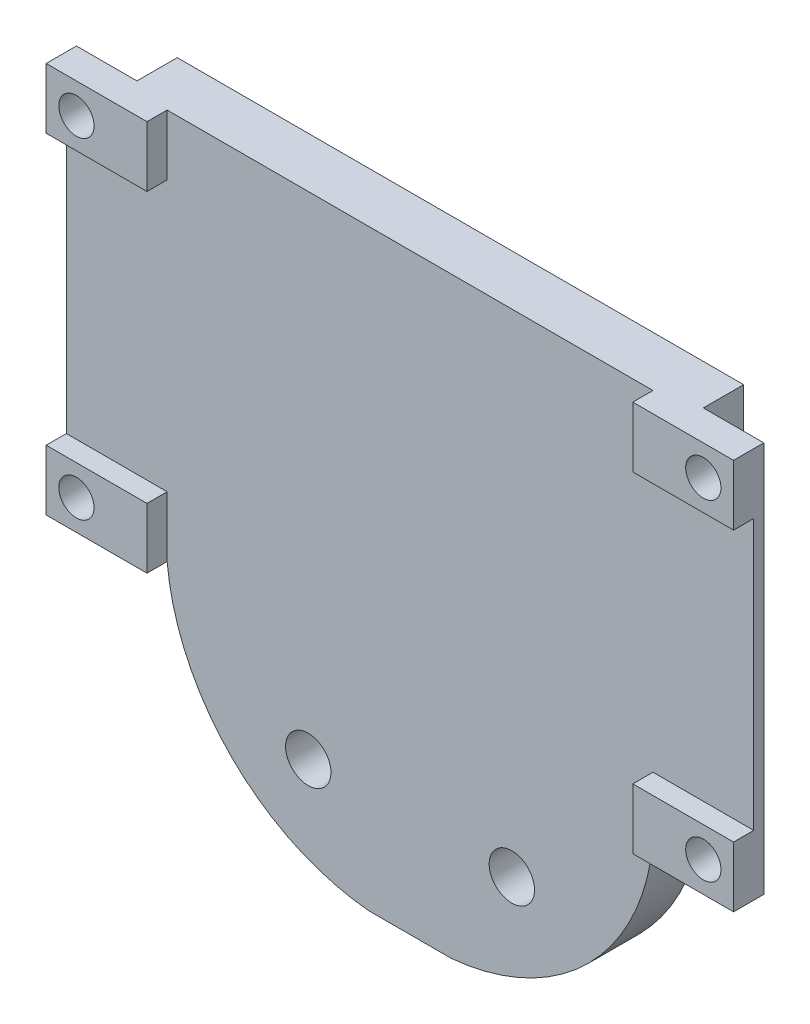
ISO-10303-21;
HEADER;
FILE_DESCRIPTION(('STEP AP214'),'2;1');
FILE_NAME('part.step','',(''),(''),'','','');
FILE_SCHEMA(('AUTOMOTIVE_DESIGN { 1 0 10303 214 1 1 1 1 }'));
ENDSEC;
DATA;
#1=APPLICATION_CONTEXT('core data for automotive mechanical design processes');
#2=APPLICATION_PROTOCOL_DEFINITION('international standard','automotive_design',2000,#1);
#3=PRODUCT_CONTEXT('',#1,'mechanical');
#4=PRODUCT('Part','Part','',(#3));
#5=PRODUCT_RELATED_PRODUCT_CATEGORY('part','',(#4));
#6=PRODUCT_DEFINITION_FORMATION('','',#4);
#7=PRODUCT_DEFINITION_CONTEXT('part definition',#1,'design');
#8=PRODUCT_DEFINITION('design','',#6,#7);
#9=PRODUCT_DEFINITION_SHAPE('','',#8);
#10=(LENGTH_UNIT() NAMED_UNIT(*) SI_UNIT(.MILLI.,.METRE.));
#11=(NAMED_UNIT(*) PLANE_ANGLE_UNIT() SI_UNIT($,.RADIAN.));
#12=(NAMED_UNIT(*) SI_UNIT($,.STERADIAN.) SOLID_ANGLE_UNIT());
#13=UNCERTAINTY_MEASURE_WITH_UNIT(LENGTH_MEASURE(1.E-05),#10,'distance_accuracy_value','');
#14=(GEOMETRIC_REPRESENTATION_CONTEXT(3) GLOBAL_UNCERTAINTY_ASSIGNED_CONTEXT((#13)) GLOBAL_UNIT_ASSIGNED_CONTEXT((#10,
#11,#12)) REPRESENTATION_CONTEXT('',''));
#15=CARTESIAN_POINT('',(0.,0.,0.));
#16=DIRECTION('',(0.,0.,1.));
#17=DIRECTION('',(1.,0.,0.));
#18=AXIS2_PLACEMENT_3D('',#15,#16,#17);
#19=CARTESIAN_POINT('',(0.,0.,1.));
#20=DIRECTION('',(0.,0.,-1.));
#21=DIRECTION('',(-1.,0.,0.));
#22=AXIS2_PLACEMENT_3D('',#19,#20,#21);
#23=PLANE('',#22);
#24=CARTESIAN_POINT('',(24.,-10.,1.));
#25=DIRECTION('',(0.,0.,1.));
#26=DIRECTION('',(1.,0.,0.));
#27=AXIS2_PLACEMENT_3D('',#24,#25,#26);
#28=CIRCLE('',#27,2.25);
#29=CARTESIAN_POINT('',(26.25,-10.,1.));
#30=VERTEX_POINT('',#29);
#31=EDGE_CURVE('E557',#30,#30,#28,.T.);
#32=ORIENTED_EDGE('',*,*,#31,.F.);
#33=EDGE_LOOP('',(#32));
#34=FACE_BOUND('',#33,.T.);
#35=CARTESIAN_POINT('',(44.2,-10.,1.));
#36=DIRECTION('',(0.,0.,1.));
#37=DIRECTION('',(1.,0.,0.));
#38=AXIS2_PLACEMENT_3D('',#35,#36,#37);
#39=CIRCLE('',#38,2.25);
#40=CARTESIAN_POINT('',(46.45,-10.,1.));
#41=VERTEX_POINT('',#40);
#42=EDGE_CURVE('E243',#41,#41,#39,.T.);
#43=ORIENTED_EDGE('',*,*,#42,.F.);
#44=EDGE_LOOP('',(#43));
#45=FACE_BOUND('',#44,.T.);
#46=DIRECTION('',(1.,0.,0.));
#47=VECTOR('',#46,1.);
#48=CARTESIAN_POINT('',(10.,-20.,1.));
#49=LINE('',#48,#47);
#50=CARTESIAN_POINT('',(30.0000000000001,-20.,1.));
#51=VERTEX_POINT('',#50);
#52=CARTESIAN_POINT('',(38.2,-20.,1.));
#53=VERTEX_POINT('',#52);
#54=EDGE_CURVE('E241',#51,#53,#49,.T.);
#55=ORIENTED_EDGE('',*,*,#54,.T.);
#56=CARTESIAN_POINT('',(36.15,2.05000000000001,1.));
#57=DIRECTION('',(0.,0.,1.));
#58=DIRECTION('',(1.,0.,0.));
#59=AXIS2_PLACEMENT_3D('',#56,#57,#58);
#60=CIRCLE('',#59,22.1450897491972);
#61=CARTESIAN_POINT('',(58.2,0.,1.));
#62=VERTEX_POINT('',#61);
#63=EDGE_CURVE('E86',#62,#53,#60,.F.);
#64=ORIENTED_EDGE('',*,*,#63,.F.);
#65=DIRECTION('',(0.,1.,0.));
#66=VECTOR('',#65,1.);
#67=CARTESIAN_POINT('',(58.2,0.,1.));
#68=LINE('',#67,#66);
#69=CARTESIAN_POINT('',(58.2,6.,1.));
#70=VERTEX_POINT('',#69);
#71=EDGE_CURVE('E238',#62,#70,#68,.T.);
#72=ORIENTED_EDGE('',*,*,#71,.T.);
#73=DIRECTION('',(-1.,0.,0.));
#74=VECTOR('',#73,1.);
#75=CARTESIAN_POINT('',(68.2,6.,1.));
#76=LINE('',#75,#74);
#77=CARTESIAN_POINT('',(68.2,6.,1.));
#78=VERTEX_POINT('',#77);
#79=EDGE_CURVE('E341',#78,#70,#76,.T.);
#80=ORIENTED_EDGE('',*,*,#79,.F.);
#81=DIRECTION('',(0.,1.,0.));
#82=VECTOR('',#81,1.);
#83=CARTESIAN_POINT('',(68.2,0.,1.));
#84=LINE('',#83,#82);
#85=CARTESIAN_POINT('',(68.2,32.8,1.));
#86=VERTEX_POINT('',#85);
#87=EDGE_CURVE('E373',#78,#86,#84,.T.);
#88=ORIENTED_EDGE('',*,*,#87,.T.);
#89=DIRECTION('',(1.,0.,0.));
#90=VECTOR('',#89,1.);
#91=CARTESIAN_POINT('',(62.2,32.8,1.));
#92=LINE('',#91,#90);
#93=CARTESIAN_POINT('',(58.2,32.8,1.));
#94=VERTEX_POINT('',#93);
#95=EDGE_CURVE('E344',#94,#86,#92,.T.);
#96=ORIENTED_EDGE('',*,*,#95,.F.);
#97=DIRECTION('',(0.,-1.,0.));
#98=VECTOR('',#97,1.);
#99=CARTESIAN_POINT('',(58.2,0.,1.));
#100=LINE('',#99,#98);
#101=CARTESIAN_POINT('',(58.2,38.8,1.));
#102=VERTEX_POINT('',#101);
#103=EDGE_CURVE('E266',#102,#94,#100,.T.);
#104=ORIENTED_EDGE('',*,*,#103,.F.);
#105=DIRECTION('',(-1.,0.,0.));
#106=VECTOR('',#105,1.);
#107=CARTESIAN_POINT('',(0.,38.8,1.));
#108=LINE('',#107,#106);
#109=CARTESIAN_POINT('',(10.,38.8,1.));
#110=VERTEX_POINT('',#109);
#111=EDGE_CURVE('E377',#102,#110,#108,.T.);
#112=ORIENTED_EDGE('',*,*,#111,.T.);
#113=DIRECTION('',(0.,-1.,0.));
#114=VECTOR('',#113,1.);
#115=CARTESIAN_POINT('',(9.99999999999999,0.,1.));
#116=LINE('',#115,#114);
#117=CARTESIAN_POINT('',(10.,32.8,1.));
#118=VERTEX_POINT('',#117);
#119=EDGE_CURVE('E481',#110,#118,#116,.T.);
#120=ORIENTED_EDGE('',*,*,#119,.T.);
#121=DIRECTION('',(1.,0.,0.));
#122=VECTOR('',#121,1.);
#123=CARTESIAN_POINT('',(6.,32.8,1.));
#124=LINE('',#123,#122);
#125=CARTESIAN_POINT('',(0.,32.8,1.));
#126=VERTEX_POINT('',#125);
#127=EDGE_CURVE('E300',#126,#118,#124,.T.);
#128=ORIENTED_EDGE('',*,*,#127,.F.);
#129=DIRECTION('',(0.,-1.,0.));
#130=VECTOR('',#129,1.);
#131=CARTESIAN_POINT('',(0.,0.,1.));
#132=LINE('',#131,#130);
#133=CARTESIAN_POINT('',(0.,6.,1.));
#134=VERTEX_POINT('',#133);
#135=EDGE_CURVE('E370',#126,#134,#132,.T.);
#136=ORIENTED_EDGE('',*,*,#135,.T.);
#137=DIRECTION('',(-1.,0.,0.));
#138=VECTOR('',#137,1.);
#139=CARTESIAN_POINT('',(6.,6.,1.));
#140=LINE('',#139,#138);
#141=CARTESIAN_POINT('',(10.,6.,1.));
#142=VERTEX_POINT('',#141);
#143=EDGE_CURVE('E323',#142,#134,#140,.T.);
#144=ORIENTED_EDGE('',*,*,#143,.F.);
#145=DIRECTION('',(0.,1.,0.));
#146=VECTOR('',#145,1.);
#147=CARTESIAN_POINT('',(10.,0.,1.));
#148=LINE('',#147,#146);
#149=CARTESIAN_POINT('',(10.,0.,1.));
#150=VERTEX_POINT('',#149);
#151=EDGE_CURVE('E497',#150,#142,#148,.T.);
#152=ORIENTED_EDGE('',*,*,#151,.F.);
#153=CARTESIAN_POINT('',(32.05,2.05000000000005,1.));
#154=DIRECTION('',(0.,0.,1.));
#155=DIRECTION('',(1.,0.,0.));
#156=AXIS2_PLACEMENT_3D('',#153,#154,#155);
#157=CIRCLE('',#156,22.1450897491973);
#158=EDGE_CURVE('E422',#150,#51,#157,.T.);
#159=ORIENTED_EDGE('',*,*,#158,.T.);
#160=EDGE_LOOP('',(#55,#64,#72,#80,#88,#96,#104,#112,#120,#128,#136,#144,#152,#159));
#161=FACE_BOUND('',#160,.T.);
#162=ADVANCED_FACE('F68',(#34,#45,#161),#23,.F.);
#163=CARTESIAN_POINT('',(0.,0.,-4.));
#164=DIRECTION('',(0.,0.,-1.));
#165=DIRECTION('',(-1.,0.,0.));
#166=AXIS2_PLACEMENT_3D('',#163,#164,#165);
#167=PLANE('',#166);
#168=CARTESIAN_POINT('',(24.,-10.,-4.));
#169=DIRECTION('',(0.,0.,-1.));
#170=DIRECTION('',(-1.,0.,0.));
#171=AXIS2_PLACEMENT_3D('',#168,#169,#170);
#172=CIRCLE('',#171,2.25);
#173=CARTESIAN_POINT('',(21.75,-10.,-4.));
#174=VERTEX_POINT('',#173);
#175=EDGE_CURVE('E72',#174,#174,#172,.T.);
#176=ORIENTED_EDGE('',*,*,#175,.F.);
#177=EDGE_LOOP('',(#176));
#178=FACE_BOUND('',#177,.T.);
#179=CARTESIAN_POINT('',(44.2,-10.,-4.));
#180=DIRECTION('',(0.,0.,-1.));
#181=DIRECTION('',(-1.,0.,0.));
#182=AXIS2_PLACEMENT_3D('',#179,#180,#181);
#183=CIRCLE('',#182,2.25);
#184=CARTESIAN_POINT('',(41.95,-10.,-4.));
#185=VERTEX_POINT('',#184);
#186=EDGE_CURVE('E412',#185,#185,#183,.T.);
#187=ORIENTED_EDGE('',*,*,#186,.F.);
#188=EDGE_LOOP('',(#187));
#189=FACE_BOUND('',#188,.T.);
#190=CARTESIAN_POINT('',(36.15,2.05000000000001,-4.));
#191=DIRECTION('',(0.,0.,-1.));
#192=DIRECTION('',(-1.,0.,0.));
#193=AXIS2_PLACEMENT_3D('',#190,#191,#192);
#194=CIRCLE('',#193,22.1450897491972);
#195=CARTESIAN_POINT('',(38.2,-20.,-4.));
#196=VERTEX_POINT('',#195);
#197=CARTESIAN_POINT('',(58.2,0.,-4.));
#198=VERTEX_POINT('',#197);
#199=EDGE_CURVE('E226',#196,#198,#194,.F.);
#200=ORIENTED_EDGE('',*,*,#199,.F.);
#201=DIRECTION('',(1.,0.,0.));
#202=VECTOR('',#201,1.);
#203=CARTESIAN_POINT('',(10.,-20.,-4.));
#204=LINE('',#203,#202);
#205=CARTESIAN_POINT('',(30.0000000000001,-20.,-4.));
#206=VERTEX_POINT('',#205);
#207=EDGE_CURVE('E426',#206,#196,#204,.T.);
#208=ORIENTED_EDGE('',*,*,#207,.F.);
#209=CARTESIAN_POINT('',(32.05,2.05000000000005,-4.));
#210=DIRECTION('',(0.,0.,-1.));
#211=DIRECTION('',(-1.,0.,0.));
#212=AXIS2_PLACEMENT_3D('',#209,#210,#211);
#213=CIRCLE('',#212,22.1450897491973);
#214=CARTESIAN_POINT('',(10.,0.,-4.));
#215=VERTEX_POINT('',#214);
#216=EDGE_CURVE('E93',#206,#215,#213,.T.);
#217=ORIENTED_EDGE('',*,*,#216,.T.);
#218=DIRECTION('',(-1.,0.,0.));
#219=VECTOR('',#218,1.);
#220=CARTESIAN_POINT('',(62.2,0.,-4.));
#221=LINE('',#220,#219);
#222=CARTESIAN_POINT('',(6.,0.,-4.));
#223=VERTEX_POINT('',#222);
#224=EDGE_CURVE('E439',#215,#223,#221,.T.);
#225=ORIENTED_EDGE('',*,*,#224,.T.);
#226=DIRECTION('',(0.,1.,0.));
#227=VECTOR('',#226,1.);
#228=CARTESIAN_POINT('',(6.,38.8,-4.));
#229=LINE('',#228,#227);
#230=CARTESIAN_POINT('',(6.,38.8,-4.));
#231=VERTEX_POINT('',#230);
#232=EDGE_CURVE('E444',#223,#231,#229,.T.);
#233=ORIENTED_EDGE('',*,*,#232,.T.);
#234=DIRECTION('',(1.,0.,0.));
#235=VECTOR('',#234,1.);
#236=CARTESIAN_POINT('',(62.2,38.8,-4.));
#237=LINE('',#236,#235);
#238=CARTESIAN_POINT('',(62.2,38.8,-4.));
#239=VERTEX_POINT('',#238);
#240=EDGE_CURVE('E447',#231,#239,#237,.T.);
#241=ORIENTED_EDGE('',*,*,#240,.T.);
#242=DIRECTION('',(0.,-1.,0.));
#243=VECTOR('',#242,1.);
#244=CARTESIAN_POINT('',(62.2,38.8,-4.));
#245=LINE('',#244,#243);
#246=CARTESIAN_POINT('',(62.2,0.,-4.));
#247=VERTEX_POINT('',#246);
#248=EDGE_CURVE('E435',#239,#247,#245,.T.);
#249=ORIENTED_EDGE('',*,*,#248,.T.);
#250=EDGE_CURVE('E441',#247,#198,#221,.T.);
#251=ORIENTED_EDGE('',*,*,#250,.T.);
#252=EDGE_LOOP('',(#200,#208,#217,#225,#233,#241,#249,#251));
#253=FACE_BOUND('',#252,.T.);
#254=ADVANCED_FACE('F562',(#178,#189,#253),#167,.T.);
#255=CARTESIAN_POINT('',(0.,-20.,0.));
#256=DIRECTION('',(0.,1.,0.));
#257=DIRECTION('',(0.,0.,1.));
#258=AXIS2_PLACEMENT_3D('',#255,#256,#257);
#259=PLANE('',#258);
#260=ORIENTED_EDGE('',*,*,#207,.T.);
#261=DIRECTION('',(0.,0.,1.));
#262=VECTOR('',#261,1.);
#263=CARTESIAN_POINT('',(38.2,-20.,-19.));
#264=LINE('',#263,#262);
#265=EDGE_CURVE('E12',#196,#53,#264,.T.);
#266=ORIENTED_EDGE('',*,*,#265,.T.);
#267=ORIENTED_EDGE('',*,*,#54,.F.);
#268=DIRECTION('',(0.,0.,1.));
#269=VECTOR('',#268,1.);
#270=CARTESIAN_POINT('',(30.0000000000001,-20.,-19.));
#271=LINE('',#270,#269);
#272=EDGE_CURVE('E78',#206,#51,#271,.T.);
#273=ORIENTED_EDGE('',*,*,#272,.F.);
#274=EDGE_LOOP('',(#260,#266,#267,#273));
#275=FACE_BOUND('',#274,.T.);
#276=ADVANCED_FACE('F559',(#275),#259,.F.);
#277=CARTESIAN_POINT('',(0.,0.,1.));
#278=DIRECTION('',(0.,1.,0.));
#279=DIRECTION('',(0.,0.,1.));
#280=AXIS2_PLACEMENT_3D('',#277,#278,#279);
#281=PLANE('',#280);
#282=DIRECTION('',(0.,0.,-1.));
#283=VECTOR('',#282,1.);
#284=CARTESIAN_POINT('',(10.,0.,1.));
#285=LINE('',#284,#283);
#286=EDGE_CURVE('E231',#150,#215,#285,.T.);
#287=ORIENTED_EDGE('',*,*,#286,.F.);
#288=DIRECTION('',(0.,0.,-1.));
#289=VECTOR('',#288,1.);
#290=CARTESIAN_POINT('',(10.,0.,3.));
#291=LINE('',#290,#289);
#292=CARTESIAN_POINT('',(10.,0.,3.));
#293=VERTEX_POINT('',#292);
#294=EDGE_CURVE('E492',#293,#150,#291,.T.);
#295=ORIENTED_EDGE('',*,*,#294,.F.);
#296=DIRECTION('',(1.,0.,0.));
#297=VECTOR('',#296,1.);
#298=CARTESIAN_POINT('',(0.,0.,3.));
#299=LINE('',#298,#297);
#300=CARTESIAN_POINT('',(0.,0.,3.));
#301=VERTEX_POINT('',#300);
#302=EDGE_CURVE('E331',#301,#293,#299,.T.);
#303=ORIENTED_EDGE('',*,*,#302,.F.);
#304=DIRECTION('',(0.,0.,-1.));
#305=VECTOR('',#304,1.);
#306=CARTESIAN_POINT('',(0.,0.,1.));
#307=LINE('',#306,#305);
#308=CARTESIAN_POINT('',(0.,0.,0.));
#309=VERTEX_POINT('',#308);
#310=EDGE_CURVE('E407',#301,#309,#307,.T.);
#311=ORIENTED_EDGE('',*,*,#310,.T.);
#312=DIRECTION('',(1.,0.,0.));
#313=VECTOR('',#312,1.);
#314=CARTESIAN_POINT('',(0.,0.,0.));
#315=LINE('',#314,#313);
#316=CARTESIAN_POINT('',(6.,0.,0.));
#317=VERTEX_POINT('',#316);
#318=EDGE_CURVE('E385',#309,#317,#315,.T.);
#319=ORIENTED_EDGE('',*,*,#318,.T.);
#320=DIRECTION('',(0.,0.,1.));
#321=VECTOR('',#320,1.);
#322=CARTESIAN_POINT('',(6.,0.,-4.));
#323=LINE('',#322,#321);
#324=EDGE_CURVE('E464',#223,#317,#323,.T.);
#325=ORIENTED_EDGE('',*,*,#324,.F.);
#326=ORIENTED_EDGE('',*,*,#224,.F.);
#327=EDGE_LOOP('',(#287,#295,#303,#311,#319,#325,#326));
#328=FACE_BOUND('',#327,.T.);
#329=ADVANCED_FACE('F613',(#328),#281,.F.);
#330=CARTESIAN_POINT('',(0.,0.,0.));
#331=DIRECTION('',(0.,0.,-1.));
#332=DIRECTION('',(-1.,0.,0.));
#333=AXIS2_PLACEMENT_3D('',#330,#331,#332);
#334=PLANE('',#333);
#335=DIRECTION('',(0.,-1.,0.));
#336=VECTOR('',#335,1.);
#337=CARTESIAN_POINT('',(62.2,38.8,0.));
#338=LINE('',#337,#336);
#339=CARTESIAN_POINT('',(62.2,38.8,0.));
#340=VERTEX_POINT('',#339);
#341=CARTESIAN_POINT('',(62.2,0.,0.));
#342=VERTEX_POINT('',#341);
#343=EDGE_CURVE('E431',#340,#342,#338,.T.);
#344=ORIENTED_EDGE('',*,*,#343,.F.);
#345=DIRECTION('',(-1.,0.,0.));
#346=VECTOR('',#345,1.);
#347=CARTESIAN_POINT('',(0.,38.8,0.));
#348=LINE('',#347,#346);
#349=CARTESIAN_POINT('',(68.2,38.8,0.));
#350=VERTEX_POINT('',#349);
#351=EDGE_CURVE('E374',#350,#340,#348,.T.);
#352=ORIENTED_EDGE('',*,*,#351,.F.);
#353=DIRECTION('',(0.,1.,0.));
#354=VECTOR('',#353,1.);
#355=CARTESIAN_POINT('',(68.2,0.,0.));
#356=LINE('',#355,#354);
#357=CARTESIAN_POINT('',(68.2,0.,0.));
#358=VERTEX_POINT('',#357);
#359=EDGE_CURVE('E389',#358,#350,#356,.T.);
#360=ORIENTED_EDGE('',*,*,#359,.F.);
#361=EDGE_CURVE('E384',#342,#358,#315,.T.);
#362=ORIENTED_EDGE('',*,*,#361,.F.);
#363=EDGE_LOOP('',(#344,#352,#360,#362));
#364=FACE_BOUND('',#363,.T.);
#365=CARTESIAN_POINT('',(65.2,3.,0.));
#366=DIRECTION('',(0.,0.,1.));
#367=DIRECTION('',(1.,0.,0.));
#368=AXIS2_PLACEMENT_3D('',#365,#366,#367);
#369=CIRCLE('',#368,1.75);
#370=CARTESIAN_POINT('',(66.95,3.,0.));
#371=VERTEX_POINT('',#370);
#372=EDGE_CURVE('E279',#371,#371,#369,.T.);
#373=ORIENTED_EDGE('',*,*,#372,.T.);
#374=EDGE_LOOP('',(#373));
#375=FACE_BOUND('',#374,.T.);
#376=CARTESIAN_POINT('',(65.2,35.8,0.));
#377=DIRECTION('',(0.,0.,1.));
#378=DIRECTION('',(1.,0.,0.));
#379=AXIS2_PLACEMENT_3D('',#376,#377,#378);
#380=CIRCLE('',#379,1.75);
#381=CARTESIAN_POINT('',(66.95,35.8,0.));
#382=VERTEX_POINT('',#381);
#383=EDGE_CURVE('E255',#382,#382,#380,.T.);
#384=ORIENTED_EDGE('',*,*,#383,.T.);
#385=EDGE_LOOP('',(#384));
#386=FACE_BOUND('',#385,.T.);
#387=ADVANCED_FACE('F570',(#364,#375,#386),#334,.T.);
#388=CARTESIAN_POINT('',(0.,0.,1.));
#389=DIRECTION('',(1.,0.,0.));
#390=DIRECTION('',(0.,0.,-1.));
#391=AXIS2_PLACEMENT_3D('',#388,#389,#390);
#392=PLANE('',#391);
#393=DIRECTION('',(0.,-1.,0.));
#394=VECTOR('',#393,1.);
#395=CARTESIAN_POINT('',(0.,0.,0.));
#396=LINE('',#395,#394);
#397=CARTESIAN_POINT('',(0.,38.8,0.));
#398=VERTEX_POINT('',#397);
#399=EDGE_CURVE('E369',#398,#309,#396,.T.);
#400=ORIENTED_EDGE('',*,*,#399,.T.);
#401=ORIENTED_EDGE('',*,*,#310,.F.);
#402=DIRECTION('',(0.,-1.,0.));
#403=VECTOR('',#402,1.);
#404=CARTESIAN_POINT('',(0.,6.,3.));
#405=LINE('',#404,#403);
#406=CARTESIAN_POINT('',(0.,6.,3.));
#407=VERTEX_POINT('',#406);
#408=EDGE_CURVE('E328',#407,#301,#405,.T.);
#409=ORIENTED_EDGE('',*,*,#408,.F.);
#410=DIRECTION('',(0.,0.,-1.));
#411=VECTOR('',#410,1.);
#412=CARTESIAN_POINT('',(0.,6.,3.));
#413=LINE('',#412,#411);
#414=EDGE_CURVE('E318',#407,#134,#413,.T.);
#415=ORIENTED_EDGE('',*,*,#414,.T.);
#416=ORIENTED_EDGE('',*,*,#135,.F.);
#417=DIRECTION('',(0.,0.,-1.));
#418=VECTOR('',#417,1.);
#419=CARTESIAN_POINT('',(0.,32.8,3.));
#420=LINE('',#419,#418);
#421=CARTESIAN_POINT('',(0.,32.8,3.));
#422=VERTEX_POINT('',#421);
#423=EDGE_CURVE('E312',#422,#126,#420,.T.);
#424=ORIENTED_EDGE('',*,*,#423,.F.);
#425=DIRECTION('',(0.,-1.,0.));
#426=VECTOR('',#425,1.);
#427=CARTESIAN_POINT('',(0.,32.8,3.));
#428=LINE('',#427,#426);
#429=CARTESIAN_POINT('',(0.,38.8,3.));
#430=VERTEX_POINT('',#429);
#431=EDGE_CURVE('E301',#430,#422,#428,.T.);
#432=ORIENTED_EDGE('',*,*,#431,.F.);
#433=DIRECTION('',(0.,0.,-1.));
#434=VECTOR('',#433,1.);
#435=CARTESIAN_POINT('',(0.,38.8,1.));
#436=LINE('',#435,#434);
#437=EDGE_CURVE('E381',#430,#398,#436,.T.);
#438=ORIENTED_EDGE('',*,*,#437,.T.);
#439=EDGE_LOOP('',(#400,#401,#409,#415,#416,#424,#432,#438));
#440=FACE_BOUND('',#439,.T.);
#441=ADVANCED_FACE('F70',(#440),#392,.F.);
#442=DIRECTION('',(0.,0.,-1.));
#443=VECTOR('',#442,1.);
#444=CARTESIAN_POINT('',(58.2,0.,3.));
#445=LINE('',#444,#443);
#446=CARTESIAN_POINT('',(58.2,0.,3.));
#447=VERTEX_POINT('',#446);
#448=EDGE_CURVE('E250',#447,#62,#445,.T.);
#449=ORIENTED_EDGE('',*,*,#448,.T.);
#450=DIRECTION('',(0.,0.,-1.));
#451=VECTOR('',#450,1.);
#452=CARTESIAN_POINT('',(58.2,0.,1.));
#453=LINE('',#452,#451);
#454=EDGE_CURVE('E223',#62,#198,#453,.T.);
#455=ORIENTED_EDGE('',*,*,#454,.T.);
#456=ORIENTED_EDGE('',*,*,#250,.F.);
#457=DIRECTION('',(0.,0.,1.));
#458=VECTOR('',#457,1.);
#459=CARTESIAN_POINT('',(62.2,0.,-4.));
#460=LINE('',#459,#458);
#461=EDGE_CURVE('E468',#247,#342,#460,.T.);
#462=ORIENTED_EDGE('',*,*,#461,.T.);
#463=ORIENTED_EDGE('',*,*,#361,.T.);
#464=DIRECTION('',(0.,0.,-1.));
#465=VECTOR('',#464,1.);
#466=CARTESIAN_POINT('',(68.2,0.,1.));
#467=LINE('',#466,#465);
#468=CARTESIAN_POINT('',(68.2,0.,3.));
#469=VERTEX_POINT('',#468);
#470=EDGE_CURVE('E403',#469,#358,#467,.T.);
#471=ORIENTED_EDGE('',*,*,#470,.F.);
#472=DIRECTION('',(1.,0.,0.));
#473=VECTOR('',#472,1.);
#474=CARTESIAN_POINT('',(62.2,0.,3.));
#475=LINE('',#474,#473);
#476=EDGE_CURVE('E259',#447,#469,#475,.T.);
#477=ORIENTED_EDGE('',*,*,#476,.F.);
#478=EDGE_LOOP('',(#449,#455,#456,#462,#463,#471,#477));
#479=FACE_BOUND('',#478,.T.);
#480=ADVANCED_FACE('F257',(#479),#281,.F.);
#481=CARTESIAN_POINT('',(68.2,0.,1.));
#482=DIRECTION('',(-1.,0.,0.));
#483=DIRECTION('',(0.,0.,1.));
#484=AXIS2_PLACEMENT_3D('',#481,#482,#483);
#485=PLANE('',#484);
#486=ORIENTED_EDGE('',*,*,#359,.T.);
#487=DIRECTION('',(0.,0.,-1.));
#488=VECTOR('',#487,1.);
#489=CARTESIAN_POINT('',(68.2,38.8,1.));
#490=LINE('',#489,#488);
#491=CARTESIAN_POINT('',(68.2,38.8,3.));
#492=VERTEX_POINT('',#491);
#493=EDGE_CURVE('E399',#492,#350,#490,.T.);
#494=ORIENTED_EDGE('',*,*,#493,.F.);
#495=DIRECTION('',(0.,1.,0.));
#496=VECTOR('',#495,1.);
#497=CARTESIAN_POINT('',(68.2,32.8,3.));
#498=LINE('',#497,#496);
#499=CARTESIAN_POINT('',(68.2,32.8,3.));
#500=VERTEX_POINT('',#499);
#501=EDGE_CURVE('E352',#500,#492,#498,.T.);
#502=ORIENTED_EDGE('',*,*,#501,.F.);
#503=DIRECTION('',(0.,0.,-1.));
#504=VECTOR('',#503,1.);
#505=CARTESIAN_POINT('',(68.2,32.8,3.));
#506=LINE('',#505,#504);
#507=EDGE_CURVE('E362',#500,#86,#506,.T.);
#508=ORIENTED_EDGE('',*,*,#507,.T.);
#509=ORIENTED_EDGE('',*,*,#87,.F.);
#510=DIRECTION('',(0.,0.,-1.));
#511=VECTOR('',#510,1.);
#512=CARTESIAN_POINT('',(68.2,6.,3.));
#513=LINE('',#512,#511);
#514=CARTESIAN_POINT('',(68.2,6.,3.));
#515=VERTEX_POINT('',#514);
#516=EDGE_CURVE('E327',#515,#78,#513,.T.);
#517=ORIENTED_EDGE('',*,*,#516,.F.);
#518=DIRECTION('',(0.,1.,0.));
#519=VECTOR('',#518,1.);
#520=CARTESIAN_POINT('',(68.2,0.,3.));
#521=LINE('',#520,#519);
#522=EDGE_CURVE('E347',#469,#515,#521,.T.);
#523=ORIENTED_EDGE('',*,*,#522,.F.);
#524=ORIENTED_EDGE('',*,*,#470,.T.);
#525=EDGE_LOOP('',(#486,#494,#502,#508,#509,#517,#523,#524));
#526=FACE_BOUND('',#525,.T.);
#527=ADVANCED_FACE('F575',(#526),#485,.F.);
#528=CARTESIAN_POINT('',(0.,38.8,1.));
#529=DIRECTION('',(0.,-1.,0.));
#530=DIRECTION('',(0.,0.,-1.));
#531=AXIS2_PLACEMENT_3D('',#528,#529,#530);
#532=PLANE('',#531);
#533=DIRECTION('',(0.,0.,-1.));
#534=VECTOR('',#533,1.);
#535=CARTESIAN_POINT('',(10.,38.8,3.));
#536=LINE('',#535,#534);
#537=CARTESIAN_POINT('',(10.,38.8,3.));
#538=VERTEX_POINT('',#537);
#539=EDGE_CURVE('E476',#538,#110,#536,.T.);
#540=ORIENTED_EDGE('',*,*,#539,.T.);
#541=ORIENTED_EDGE('',*,*,#111,.F.);
#542=DIRECTION('',(0.,0.,-1.));
#543=VECTOR('',#542,1.);
#544=CARTESIAN_POINT('',(58.2,38.8,3.));
#545=LINE('',#544,#543);
#546=CARTESIAN_POINT('',(58.2,38.8,3.));
#547=VERTEX_POINT('',#546);
#548=EDGE_CURVE('E508',#547,#102,#545,.T.);
#549=ORIENTED_EDGE('',*,*,#548,.F.);
#550=DIRECTION('',(-1.,0.,0.));
#551=VECTOR('',#550,1.);
#552=CARTESIAN_POINT('',(68.2,38.8,3.));
#553=LINE('',#552,#551);
#554=EDGE_CURVE('E356',#492,#547,#553,.T.);
#555=ORIENTED_EDGE('',*,*,#554,.F.);
#556=ORIENTED_EDGE('',*,*,#493,.T.);
#557=ORIENTED_EDGE('',*,*,#351,.T.);
#558=DIRECTION('',(0.,0.,1.));
#559=VECTOR('',#558,1.);
#560=CARTESIAN_POINT('',(62.2,38.8,-4.));
#561=LINE('',#560,#559);
#562=EDGE_CURVE('E450',#239,#340,#561,.T.);
#563=ORIENTED_EDGE('',*,*,#562,.F.);
#564=ORIENTED_EDGE('',*,*,#240,.F.);
#565=DIRECTION('',(0.,0.,1.));
#566=VECTOR('',#565,1.);
#567=CARTESIAN_POINT('',(6.,38.8,-4.));
#568=LINE('',#567,#566);
#569=CARTESIAN_POINT('',(6.,38.8,0.));
#570=VERTEX_POINT('',#569);
#571=EDGE_CURVE('E460',#231,#570,#568,.T.);
#572=ORIENTED_EDGE('',*,*,#571,.T.);
#573=EDGE_CURVE('E392',#570,#398,#348,.T.);
#574=ORIENTED_EDGE('',*,*,#573,.T.);
#575=ORIENTED_EDGE('',*,*,#437,.F.);
#576=DIRECTION('',(-1.,0.,0.));
#577=VECTOR('',#576,1.);
#578=CARTESIAN_POINT('',(0.,38.8,3.));
#579=LINE('',#578,#577);
#580=EDGE_CURVE('E308',#538,#430,#579,.T.);
#581=ORIENTED_EDGE('',*,*,#580,.F.);
#582=EDGE_LOOP('',(#540,#541,#549,#555,#556,#557,#563,#564,#572,#574,#575,#581));
#583=FACE_BOUND('',#582,.T.);
#584=ADVANCED_FACE('F533',(#583),#532,.F.);
#585=DIRECTION('',(0.,1.,0.));
#586=VECTOR('',#585,1.);
#587=CARTESIAN_POINT('',(6.,38.8,0.));
#588=LINE('',#587,#586);
#589=EDGE_CURVE('E440',#317,#570,#588,.T.);
#590=ORIENTED_EDGE('',*,*,#589,.F.);
#591=ORIENTED_EDGE('',*,*,#318,.F.);
#592=ORIENTED_EDGE('',*,*,#399,.F.);
#593=ORIENTED_EDGE('',*,*,#573,.F.);
#594=EDGE_LOOP('',(#590,#591,#592,#593));
#595=FACE_BOUND('',#594,.T.);
#596=CARTESIAN_POINT('',(3.,35.8,0.));
#597=DIRECTION('',(0.,0.,1.));
#598=DIRECTION('',(1.,0.,0.));
#599=AXIS2_PLACEMENT_3D('',#596,#597,#598);
#600=CIRCLE('',#599,1.75);
#601=CARTESIAN_POINT('',(4.75,35.8,0.));
#602=VERTEX_POINT('',#601);
#603=EDGE_CURVE('E296',#602,#602,#600,.T.);
#604=ORIENTED_EDGE('',*,*,#603,.T.);
#605=EDGE_LOOP('',(#604));
#606=FACE_BOUND('',#605,.T.);
#607=CARTESIAN_POINT('',(3.,3.,0.));
#608=DIRECTION('',(0.,0.,1.));
#609=DIRECTION('',(1.,0.,0.));
#610=AXIS2_PLACEMENT_3D('',#607,#608,#609);
#611=CIRCLE('',#610,1.75);
#612=CARTESIAN_POINT('',(4.75,3.,0.));
#613=VERTEX_POINT('',#612);
#614=EDGE_CURVE('E269',#613,#613,#611,.T.);
#615=ORIENTED_EDGE('',*,*,#614,.T.);
#616=EDGE_LOOP('',(#615));
#617=FACE_BOUND('',#616,.T.);
#618=ADVANCED_FACE('F605',(#595,#606,#617),#334,.T.);
#619=CARTESIAN_POINT('',(62.2,32.8,3.));
#620=DIRECTION('',(0.,1.,0.));
#621=DIRECTION('',(0.,0.,1.));
#622=AXIS2_PLACEMENT_3D('',#619,#620,#621);
#623=PLANE('',#622);
#624=ORIENTED_EDGE('',*,*,#95,.T.);
#625=ORIENTED_EDGE('',*,*,#507,.F.);
#626=DIRECTION('',(1.,0.,0.));
#627=VECTOR('',#626,1.);
#628=CARTESIAN_POINT('',(62.2,32.8,3.));
#629=LINE('',#628,#627);
#630=CARTESIAN_POINT('',(58.2,32.8,3.));
#631=VERTEX_POINT('',#630);
#632=EDGE_CURVE('E359',#631,#500,#629,.T.);
#633=ORIENTED_EDGE('',*,*,#632,.F.);
#634=DIRECTION('',(0.,0.,-1.));
#635=VECTOR('',#634,1.);
#636=CARTESIAN_POINT('',(58.2,32.8,3.));
#637=LINE('',#636,#635);
#638=EDGE_CURVE('E509',#631,#94,#637,.T.);
#639=ORIENTED_EDGE('',*,*,#638,.T.);
#640=EDGE_LOOP('',(#624,#625,#633,#639));
#641=FACE_BOUND('',#640,.T.);
#642=ADVANCED_FACE('F525',(#641),#623,.F.);
#643=CARTESIAN_POINT('',(0.,0.,3.));
#644=DIRECTION('',(0.,0.,1.));
#645=DIRECTION('',(1.,0.,0.));
#646=AXIS2_PLACEMENT_3D('',#643,#644,#645);
#647=PLANE('',#646);
#648=ORIENTED_EDGE('',*,*,#501,.T.);
#649=ORIENTED_EDGE('',*,*,#554,.T.);
#650=DIRECTION('',(0.,-1.,0.));
#651=VECTOR('',#650,1.);
#652=CARTESIAN_POINT('',(58.2,0.,3.));
#653=LINE('',#652,#651);
#654=EDGE_CURVE('E504',#547,#631,#653,.T.);
#655=ORIENTED_EDGE('',*,*,#654,.T.);
#656=ORIENTED_EDGE('',*,*,#632,.T.);
#657=EDGE_LOOP('',(#648,#649,#655,#656));
#658=FACE_BOUND('',#657,.T.);
#659=CARTESIAN_POINT('',(65.2,35.8,3.));
#660=DIRECTION('',(0.,0.,1.));
#661=DIRECTION('',(1.,0.,0.));
#662=AXIS2_PLACEMENT_3D('',#659,#660,#661);
#663=CIRCLE('',#662,1.75);
#664=CARTESIAN_POINT('',(66.95,35.8,3.));
#665=VERTEX_POINT('',#664);
#666=EDGE_CURVE('E283',#665,#665,#663,.T.);
#667=ORIENTED_EDGE('',*,*,#666,.F.);
#668=EDGE_LOOP('',(#667));
#669=FACE_BOUND('',#668,.T.);
#670=ADVANCED_FACE('F529',(#658,#669),#647,.T.);
#671=CARTESIAN_POINT('',(68.2,6.,3.));
#672=DIRECTION('',(0.,-1.,0.));
#673=DIRECTION('',(1.,0.,0.));
#674=AXIS2_PLACEMENT_3D('',#671,#672,#673);
#675=PLANE('',#674);
#676=ORIENTED_EDGE('',*,*,#79,.T.);
#677=DIRECTION('',(0.,0.,-1.));
#678=VECTOR('',#677,1.);
#679=CARTESIAN_POINT('',(58.2,6.,3.));
#680=LINE('',#679,#678);
#681=CARTESIAN_POINT('',(58.2,6.,3.));
#682=VERTEX_POINT('',#681);
#683=EDGE_CURVE('E253',#682,#70,#680,.T.);
#684=ORIENTED_EDGE('',*,*,#683,.F.);
#685=DIRECTION('',(-1.,0.,0.));
#686=VECTOR('',#685,1.);
#687=CARTESIAN_POINT('',(68.2,6.,3.));
#688=LINE('',#687,#686);
#689=EDGE_CURVE('E340',#515,#682,#688,.T.);
#690=ORIENTED_EDGE('',*,*,#689,.F.);
#691=ORIENTED_EDGE('',*,*,#516,.T.);
#692=EDGE_LOOP('',(#676,#684,#690,#691));
#693=FACE_BOUND('',#692,.T.);
#694=ADVANCED_FACE('F582',(#693),#675,.F.);
#695=CARTESIAN_POINT('',(0.,0.,3.));
#696=DIRECTION('',(0.,0.,1.));
#697=DIRECTION('',(1.,0.,0.));
#698=AXIS2_PLACEMENT_3D('',#695,#696,#697);
#699=PLANE('',#698);
#700=CARTESIAN_POINT('',(65.2,3.,3.));
#701=DIRECTION('',(0.,0.,1.));
#702=DIRECTION('',(1.,0.,0.));
#703=AXIS2_PLACEMENT_3D('',#700,#701,#702);
#704=CIRCLE('',#703,1.75);
#705=CARTESIAN_POINT('',(66.95,3.,3.));
#706=VERTEX_POINT('',#705);
#707=EDGE_CURVE('E274',#706,#706,#704,.T.);
#708=ORIENTED_EDGE('',*,*,#707,.F.);
#709=EDGE_LOOP('',(#708));
#710=FACE_BOUND('',#709,.T.);
#711=ORIENTED_EDGE('',*,*,#476,.T.);
#712=ORIENTED_EDGE('',*,*,#522,.T.);
#713=ORIENTED_EDGE('',*,*,#689,.T.);
#714=DIRECTION('',(0.,1.,0.));
#715=VECTOR('',#714,1.);
#716=CARTESIAN_POINT('',(58.2,0.,3.));
#717=LINE('',#716,#715);
#718=EDGE_CURVE('E261',#447,#682,#717,.T.);
#719=ORIENTED_EDGE('',*,*,#718,.F.);
#720=EDGE_LOOP('',(#711,#712,#713,#719));
#721=FACE_BOUND('',#720,.T.);
#722=ADVANCED_FACE('F580',(#710,#721),#699,.T.);
#723=CARTESIAN_POINT('',(6.,6.,3.));
#724=DIRECTION('',(0.,-1.,0.));
#725=DIRECTION('',(1.,0.,0.));
#726=AXIS2_PLACEMENT_3D('',#723,#724,#725);
#727=PLANE('',#726);
#728=ORIENTED_EDGE('',*,*,#143,.T.);
#729=ORIENTED_EDGE('',*,*,#414,.F.);
#730=DIRECTION('',(-1.,0.,0.));
#731=VECTOR('',#730,1.);
#732=CARTESIAN_POINT('',(6.,6.,3.));
#733=LINE('',#732,#731);
#734=CARTESIAN_POINT('',(10.,6.,3.));
#735=VERTEX_POINT('',#734);
#736=EDGE_CURVE('E322',#735,#407,#733,.T.);
#737=ORIENTED_EDGE('',*,*,#736,.F.);
#738=DIRECTION('',(0.,0.,-1.));
#739=VECTOR('',#738,1.);
#740=CARTESIAN_POINT('',(10.,6.,3.));
#741=LINE('',#740,#739);
#742=EDGE_CURVE('E493',#735,#142,#741,.T.);
#743=ORIENTED_EDGE('',*,*,#742,.T.);
#744=EDGE_LOOP('',(#728,#729,#737,#743));
#745=FACE_BOUND('',#744,.T.);
#746=ADVANCED_FACE('F549',(#745),#727,.F.);
#747=CARTESIAN_POINT('',(0.,0.,3.));
#748=DIRECTION('',(0.,0.,1.));
#749=DIRECTION('',(1.,0.,0.));
#750=AXIS2_PLACEMENT_3D('',#747,#748,#749);
#751=PLANE('',#750);
#752=CARTESIAN_POINT('',(3.,3.,3.));
#753=DIRECTION('',(0.,0.,1.));
#754=DIRECTION('',(1.,0.,0.));
#755=AXIS2_PLACEMENT_3D('',#752,#753,#754);
#756=CIRCLE('',#755,1.75);
#757=CARTESIAN_POINT('',(4.75,3.,3.));
#758=VERTEX_POINT('',#757);
#759=EDGE_CURVE('E273',#758,#758,#756,.T.);
#760=ORIENTED_EDGE('',*,*,#759,.F.);
#761=EDGE_LOOP('',(#760));
#762=FACE_BOUND('',#761,.T.);
#763=ORIENTED_EDGE('',*,*,#408,.T.);
#764=ORIENTED_EDGE('',*,*,#302,.T.);
#765=DIRECTION('',(0.,1.,0.));
#766=VECTOR('',#765,1.);
#767=CARTESIAN_POINT('',(10.,0.,3.));
#768=LINE('',#767,#766);
#769=EDGE_CURVE('E488',#293,#735,#768,.T.);
#770=ORIENTED_EDGE('',*,*,#769,.T.);
#771=ORIENTED_EDGE('',*,*,#736,.T.);
#772=EDGE_LOOP('',(#763,#764,#770,#771));
#773=FACE_BOUND('',#772,.T.);
#774=ADVANCED_FACE('F638',(#762,#773),#751,.T.);
#775=CARTESIAN_POINT('',(6.,32.8,3.));
#776=DIRECTION('',(0.,1.,0.));
#777=DIRECTION('',(0.,0.,1.));
#778=AXIS2_PLACEMENT_3D('',#775,#776,#777);
#779=PLANE('',#778);
#780=ORIENTED_EDGE('',*,*,#127,.T.);
#781=DIRECTION('',(0.,0.,-1.));
#782=VECTOR('',#781,1.);
#783=CARTESIAN_POINT('',(10.,32.8,3.));
#784=LINE('',#783,#782);
#785=CARTESIAN_POINT('',(10.,32.8,3.));
#786=VERTEX_POINT('',#785);
#787=EDGE_CURVE('E477',#786,#118,#784,.T.);
#788=ORIENTED_EDGE('',*,*,#787,.F.);
#789=DIRECTION('',(1.,0.,0.));
#790=VECTOR('',#789,1.);
#791=CARTESIAN_POINT('',(6.,32.8,3.));
#792=LINE('',#791,#790);
#793=EDGE_CURVE('E305',#422,#786,#792,.T.);
#794=ORIENTED_EDGE('',*,*,#793,.F.);
#795=ORIENTED_EDGE('',*,*,#423,.T.);
#796=EDGE_LOOP('',(#780,#788,#794,#795));
#797=FACE_BOUND('',#796,.T.);
#798=ADVANCED_FACE('F541',(#797),#779,.F.);
#799=CARTESIAN_POINT('',(0.,0.,3.));
#800=DIRECTION('',(0.,0.,-1.));
#801=DIRECTION('',(-1.,0.,0.));
#802=AXIS2_PLACEMENT_3D('',#799,#800,#801);
#803=PLANE('',#802);
#804=CARTESIAN_POINT('',(3.,35.8,3.));
#805=DIRECTION('',(0.,0.,1.));
#806=DIRECTION('',(1.,0.,0.));
#807=AXIS2_PLACEMENT_3D('',#804,#805,#806);
#808=CIRCLE('',#807,1.75);
#809=CARTESIAN_POINT('',(4.75,35.8,3.));
#810=VERTEX_POINT('',#809);
#811=EDGE_CURVE('E278',#810,#810,#808,.T.);
#812=ORIENTED_EDGE('',*,*,#811,.F.);
#813=EDGE_LOOP('',(#812));
#814=FACE_BOUND('',#813,.T.);
#815=ORIENTED_EDGE('',*,*,#431,.T.);
#816=ORIENTED_EDGE('',*,*,#793,.T.);
#817=DIRECTION('',(0.,-1.,0.));
#818=VECTOR('',#817,1.);
#819=CARTESIAN_POINT('',(9.99999999999999,0.,3.));
#820=LINE('',#819,#818);
#821=EDGE_CURVE('E472',#538,#786,#820,.T.);
#822=ORIENTED_EDGE('',*,*,#821,.F.);
#823=ORIENTED_EDGE('',*,*,#580,.T.);
#824=EDGE_LOOP('',(#815,#816,#822,#823));
#825=FACE_BOUND('',#824,.T.);
#826=ADVANCED_FACE('F645',(#814,#825),#803,.F.);
#827=CARTESIAN_POINT('',(3.,35.8,0.));
#828=DIRECTION('',(0.,0.,1.));
#829=DIRECTION('',(1.,0.,0.));
#830=AXIS2_PLACEMENT_3D('',#827,#828,#829);
#831=CYLINDRICAL_SURFACE('',#830,1.75);
#832=ORIENTED_EDGE('',*,*,#603,.F.);
#833=EDGE_LOOP('',(#832));
#834=FACE_BOUND('',#833,.T.);
#835=ORIENTED_EDGE('',*,*,#811,.T.);
#836=EDGE_LOOP('',(#835));
#837=FACE_BOUND('',#836,.T.);
#838=ADVANCED_FACE('F652',(#834,#837),#831,.F.);
#839=CARTESIAN_POINT('',(3.,3.,0.));
#840=DIRECTION('',(0.,0.,1.));
#841=DIRECTION('',(1.,0.,0.));
#842=AXIS2_PLACEMENT_3D('',#839,#840,#841);
#843=CYLINDRICAL_SURFACE('',#842,1.75);
#844=ORIENTED_EDGE('',*,*,#614,.F.);
#845=EDGE_LOOP('',(#844));
#846=FACE_BOUND('',#845,.T.);
#847=ORIENTED_EDGE('',*,*,#759,.T.);
#848=EDGE_LOOP('',(#847));
#849=FACE_BOUND('',#848,.T.);
#850=ADVANCED_FACE('F656',(#846,#849),#843,.F.);
#851=CARTESIAN_POINT('',(65.2,3.,0.));
#852=DIRECTION('',(0.,0.,1.));
#853=DIRECTION('',(1.,0.,0.));
#854=AXIS2_PLACEMENT_3D('',#851,#852,#853);
#855=CYLINDRICAL_SURFACE('',#854,1.75);
#856=ORIENTED_EDGE('',*,*,#372,.F.);
#857=EDGE_LOOP('',(#856));
#858=FACE_BOUND('',#857,.T.);
#859=ORIENTED_EDGE('',*,*,#707,.T.);
#860=EDGE_LOOP('',(#859));
#861=FACE_BOUND('',#860,.T.);
#862=ADVANCED_FACE('F661',(#858,#861),#855,.F.);
#863=CARTESIAN_POINT('',(65.2,35.8,0.));
#864=DIRECTION('',(0.,0.,1.));
#865=DIRECTION('',(1.,0.,0.));
#866=AXIS2_PLACEMENT_3D('',#863,#864,#865);
#867=CYLINDRICAL_SURFACE('',#866,1.75);
#868=ORIENTED_EDGE('',*,*,#383,.F.);
#869=EDGE_LOOP('',(#868));
#870=FACE_BOUND('',#869,.T.);
#871=ORIENTED_EDGE('',*,*,#666,.T.);
#872=EDGE_LOOP('',(#871));
#873=FACE_BOUND('',#872,.T.);
#874=ADVANCED_FACE('F658',(#870,#873),#867,.F.);
#875=CARTESIAN_POINT('',(58.2,0.,3.));
#876=DIRECTION('',(-1.,0.,0.));
#877=DIRECTION('',(0.,0.,1.));
#878=AXIS2_PLACEMENT_3D('',#875,#876,#877);
#879=PLANE('',#878);
#880=ORIENTED_EDGE('',*,*,#71,.F.);
#881=ORIENTED_EDGE('',*,*,#448,.F.);
#882=ORIENTED_EDGE('',*,*,#718,.T.);
#883=ORIENTED_EDGE('',*,*,#683,.T.);
#884=EDGE_LOOP('',(#880,#881,#882,#883));
#885=FACE_BOUND('',#884,.T.);
#886=ADVANCED_FACE('F248',(#885),#879,.T.);
#887=CARTESIAN_POINT('',(58.2,0.,3.));
#888=DIRECTION('',(1.,0.,0.));
#889=DIRECTION('',(0.,0.,-1.));
#890=AXIS2_PLACEMENT_3D('',#887,#888,#889);
#891=PLANE('',#890);
#892=ORIENTED_EDGE('',*,*,#548,.T.);
#893=ORIENTED_EDGE('',*,*,#103,.T.);
#894=ORIENTED_EDGE('',*,*,#638,.F.);
#895=ORIENTED_EDGE('',*,*,#654,.F.);
#896=EDGE_LOOP('',(#892,#893,#894,#895));
#897=FACE_BOUND('',#896,.T.);
#898=ADVANCED_FACE('F520',(#897),#891,.F.);
#899=CARTESIAN_POINT('',(10.,0.,3.));
#900=DIRECTION('',(-1.,0.,0.));
#901=DIRECTION('',(0.,0.,1.));
#902=AXIS2_PLACEMENT_3D('',#899,#900,#901);
#903=PLANE('',#902);
#904=ORIENTED_EDGE('',*,*,#294,.T.);
#905=ORIENTED_EDGE('',*,*,#151,.T.);
#906=ORIENTED_EDGE('',*,*,#742,.F.);
#907=ORIENTED_EDGE('',*,*,#769,.F.);
#908=EDGE_LOOP('',(#904,#905,#906,#907));
#909=FACE_BOUND('',#908,.T.);
#910=ADVANCED_FACE('F553',(#909),#903,.F.);
#911=CARTESIAN_POINT('',(9.99999999999999,0.,3.));
#912=DIRECTION('',(1.,0.,0.));
#913=DIRECTION('',(0.,1.,0.));
#914=AXIS2_PLACEMENT_3D('',#911,#912,#913);
#915=PLANE('',#914);
#916=ORIENTED_EDGE('',*,*,#119,.F.);
#917=ORIENTED_EDGE('',*,*,#539,.F.);
#918=ORIENTED_EDGE('',*,*,#821,.T.);
#919=ORIENTED_EDGE('',*,*,#787,.T.);
#920=EDGE_LOOP('',(#916,#917,#918,#919));
#921=FACE_BOUND('',#920,.T.);
#922=ADVANCED_FACE('F537',(#921),#915,.T.);
#923=CARTESIAN_POINT('',(62.2,38.8,-4.));
#924=DIRECTION('',(-1.,0.,0.));
#925=DIRECTION('',(0.,-1.,0.));
#926=AXIS2_PLACEMENT_3D('',#923,#924,#925);
#927=PLANE('',#926);
#928=ORIENTED_EDGE('',*,*,#343,.T.);
#929=ORIENTED_EDGE('',*,*,#461,.F.);
#930=ORIENTED_EDGE('',*,*,#248,.F.);
#931=ORIENTED_EDGE('',*,*,#562,.T.);
#932=EDGE_LOOP('',(#928,#929,#930,#931));
#933=FACE_BOUND('',#932,.T.);
#934=ADVANCED_FACE('F566',(#933),#927,.F.);
#935=CARTESIAN_POINT('',(6.,38.8,-4.));
#936=DIRECTION('',(1.,0.,0.));
#937=DIRECTION('',(0.,1.,0.));
#938=AXIS2_PLACEMENT_3D('',#935,#936,#937);
#939=PLANE('',#938);
#940=ORIENTED_EDGE('',*,*,#589,.T.);
#941=ORIENTED_EDGE('',*,*,#571,.F.);
#942=ORIENTED_EDGE('',*,*,#232,.F.);
#943=ORIENTED_EDGE('',*,*,#324,.T.);
#944=EDGE_LOOP('',(#940,#941,#942,#943));
#945=FACE_BOUND('',#944,.T.);
#946=ADVANCED_FACE('F633',(#945),#939,.F.);
#947=CARTESIAN_POINT('',(32.05,2.05000000000005,-19.));
#948=DIRECTION('',(0.,0.,1.));
#949=DIRECTION('',(1.,0.,0.));
#950=AXIS2_PLACEMENT_3D('',#947,#948,#949);
#951=CYLINDRICAL_SURFACE('',#950,22.1450897491973);
#952=ORIENTED_EDGE('',*,*,#272,.T.);
#953=ORIENTED_EDGE('',*,*,#158,.F.);
#954=ORIENTED_EDGE('',*,*,#286,.T.);
#955=ORIENTED_EDGE('',*,*,#216,.F.);
#956=EDGE_LOOP('',(#952,#953,#954,#955));
#957=FACE_BOUND('',#956,.T.);
#958=ADVANCED_FACE('F627',(#957),#951,.T.);
#959=CARTESIAN_POINT('',(36.15,2.05000000000001,-19.));
#960=DIRECTION('',(0.,0.,1.));
#961=DIRECTION('',(1.,0.,0.));
#962=AXIS2_PLACEMENT_3D('',#959,#960,#961);
#963=CYLINDRICAL_SURFACE('',#962,22.1450897491972);
#964=ORIENTED_EDGE('',*,*,#199,.T.);
#965=ORIENTED_EDGE('',*,*,#454,.F.);
#966=ORIENTED_EDGE('',*,*,#63,.T.);
#967=ORIENTED_EDGE('',*,*,#265,.F.);
#968=EDGE_LOOP('',(#964,#965,#966,#967));
#969=FACE_BOUND('',#968,.T.);
#970=ADVANCED_FACE('F224',(#969),#963,.T.);
#971=CARTESIAN_POINT('',(44.2,-10.,-19.));
#972=DIRECTION('',(0.,0.,1.));
#973=DIRECTION('',(1.,0.,0.));
#974=AXIS2_PLACEMENT_3D('',#971,#972,#973);
#975=CYLINDRICAL_SURFACE('',#974,2.25);
#976=ORIENTED_EDGE('',*,*,#186,.T.);
#977=EDGE_LOOP('',(#976));
#978=FACE_BOUND('',#977,.T.);
#979=ORIENTED_EDGE('',*,*,#42,.T.);
#980=EDGE_LOOP('',(#979));
#981=FACE_BOUND('',#980,.T.);
#982=ADVANCED_FACE('F683',(#978,#981),#975,.F.);
#983=CARTESIAN_POINT('',(24.,-10.,-19.));
#984=DIRECTION('',(0.,0.,1.));
#985=DIRECTION('',(1.,0.,0.));
#986=AXIS2_PLACEMENT_3D('',#983,#984,#985);
#987=CYLINDRICAL_SURFACE('',#986,2.25);
#988=ORIENTED_EDGE('',*,*,#175,.T.);
#989=EDGE_LOOP('',(#988));
#990=FACE_BOUND('',#989,.T.);
#991=ORIENTED_EDGE('',*,*,#31,.T.);
#992=EDGE_LOOP('',(#991));
#993=FACE_BOUND('',#992,.T.);
#994=ADVANCED_FACE('F686',(#990,#993),#987,.F.);
#995=CLOSED_SHELL('',(#162,#254,#276,#329,#387,#441,#480,#527,#584,#618,#642,#670,#694,#722,
#746,#774,#798,#826,#838,#850,#862,#874,#886,#898,#910,#922,#934,#946,#958,#970,#982,#994));
#996=MANIFOLD_SOLID_BREP('B2',#995);
#997=ADVANCED_BREP_SHAPE_REPRESENTATION('',(#18,#996),#14);
#998=SHAPE_DEFINITION_REPRESENTATION(#9,#997);
ENDSEC;
END-ISO-10303-21;
